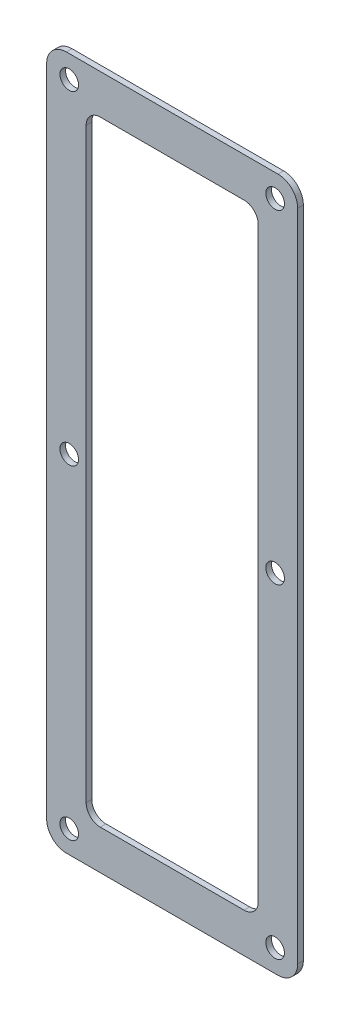
ISO-10303-21;
HEADER;
FILE_DESCRIPTION(('STEP AP214'),'2;1');
FILE_NAME('part.step','',(''),(''),'','','');
FILE_SCHEMA(('AUTOMOTIVE_DESIGN { 1 0 10303 214 1 1 1 1 }'));
ENDSEC;
DATA;
#1=APPLICATION_CONTEXT('core data for automotive mechanical design processes');
#2=APPLICATION_PROTOCOL_DEFINITION('international standard','automotive_design',2000,#1);
#3=PRODUCT_CONTEXT('',#1,'mechanical');
#4=PRODUCT('Part','Part','',(#3));
#5=PRODUCT_RELATED_PRODUCT_CATEGORY('part','',(#4));
#6=PRODUCT_DEFINITION_FORMATION('','',#4);
#7=PRODUCT_DEFINITION_CONTEXT('part definition',#1,'design');
#8=PRODUCT_DEFINITION('design','',#6,#7);
#9=PRODUCT_DEFINITION_SHAPE('','',#8);
#10=(LENGTH_UNIT() NAMED_UNIT(*) SI_UNIT(.MILLI.,.METRE.));
#11=(NAMED_UNIT(*) PLANE_ANGLE_UNIT() SI_UNIT($,.RADIAN.));
#12=(NAMED_UNIT(*) SI_UNIT($,.STERADIAN.) SOLID_ANGLE_UNIT());
#13=UNCERTAINTY_MEASURE_WITH_UNIT(LENGTH_MEASURE(1.E-05),#10,'distance_accuracy_value','');
#14=(GEOMETRIC_REPRESENTATION_CONTEXT(3) GLOBAL_UNCERTAINTY_ASSIGNED_CONTEXT((#13)) GLOBAL_UNIT_ASSIGNED_CONTEXT((#10,
#11,#12)) REPRESENTATION_CONTEXT('',''));
#15=CARTESIAN_POINT('',(0.,0.,0.));
#16=DIRECTION('',(0.,0.,1.));
#17=DIRECTION('',(1.,0.,0.));
#18=AXIS2_PLACEMENT_3D('',#15,#16,#17);
#19=CARTESIAN_POINT('',(0.,0.,0.));
#20=DIRECTION('',(0.,0.,-1.));
#21=DIRECTION('',(-1.,0.,0.));
#22=AXIS2_PLACEMENT_3D('',#19,#20,#21);
#23=PLANE('',#22);
#24=CARTESIAN_POINT('',(36.5,115.,0.));
#25=DIRECTION('',(0.,0.,1.));
#26=DIRECTION('',(1.,0.,0.));
#27=AXIS2_PLACEMENT_3D('',#24,#25,#26);
#28=CIRCLE('',#27,3.30000000000001);
#29=CARTESIAN_POINT('',(39.8,115.,0.));
#30=VERTEX_POINT('',#29);
#31=EDGE_CURVE('E315',#30,#30,#28,.T.);
#32=ORIENTED_EDGE('',*,*,#31,.T.);
#33=EDGE_LOOP('',(#32));
#34=FACE_BOUND('',#33,.T.);
#35=CARTESIAN_POINT('',(-36.5,-115.,0.));
#36=DIRECTION('',(0.,0.,1.));
#37=DIRECTION('',(1.,0.,0.));
#38=AXIS2_PLACEMENT_3D('',#35,#36,#37);
#39=CIRCLE('',#38,3.30000000000001);
#40=CARTESIAN_POINT('',(-33.2,-115.,0.));
#41=VERTEX_POINT('',#40);
#42=EDGE_CURVE('E309',#41,#41,#39,.T.);
#43=ORIENTED_EDGE('',*,*,#42,.T.);
#44=EDGE_LOOP('',(#43));
#45=FACE_BOUND('',#44,.T.);
#46=CARTESIAN_POINT('',(-36.5,115.,0.));
#47=DIRECTION('',(0.,0.,1.));
#48=DIRECTION('',(1.,0.,0.));
#49=AXIS2_PLACEMENT_3D('',#46,#47,#48);
#50=CIRCLE('',#49,3.30000000000001);
#51=CARTESIAN_POINT('',(-33.2,115.,0.));
#52=VERTEX_POINT('',#51);
#53=EDGE_CURVE('E303',#52,#52,#50,.T.);
#54=ORIENTED_EDGE('',*,*,#53,.T.);
#55=EDGE_LOOP('',(#54));
#56=FACE_BOUND('',#55,.T.);
#57=CARTESIAN_POINT('',(36.5,-115.,0.));
#58=DIRECTION('',(0.,0.,1.));
#59=DIRECTION('',(1.,0.,0.));
#60=AXIS2_PLACEMENT_3D('',#57,#58,#59);
#61=CIRCLE('',#60,3.30000000000001);
#62=CARTESIAN_POINT('',(39.8,-115.,0.));
#63=VERTEX_POINT('',#62);
#64=EDGE_CURVE('E297',#63,#63,#61,.T.);
#65=ORIENTED_EDGE('',*,*,#64,.T.);
#66=EDGE_LOOP('',(#65));
#67=FACE_BOUND('',#66,.T.);
#68=CARTESIAN_POINT('',(-36.5,0.,0.));
#69=DIRECTION('',(0.,0.,1.));
#70=DIRECTION('',(1.,0.,0.));
#71=AXIS2_PLACEMENT_3D('',#68,#69,#70);
#72=CIRCLE('',#71,3.30000000000001);
#73=CARTESIAN_POINT('',(-33.2,0.,0.));
#74=VERTEX_POINT('',#73);
#75=EDGE_CURVE('E291',#74,#74,#72,.T.);
#76=ORIENTED_EDGE('',*,*,#75,.T.);
#77=EDGE_LOOP('',(#76));
#78=FACE_BOUND('',#77,.T.);
#79=DIRECTION('',(0.,-1.,0.));
#80=VECTOR('',#79,1.);
#81=CARTESIAN_POINT('',(-30.5,-109.,0.));
#82=LINE('',#81,#80);
#83=CARTESIAN_POINT('',(-30.5,104.,0.));
#84=VERTEX_POINT('',#83);
#85=CARTESIAN_POINT('',(-30.5,-104.,0.));
#86=VERTEX_POINT('',#85);
#87=EDGE_CURVE('E273',#84,#86,#82,.T.);
#88=ORIENTED_EDGE('',*,*,#87,.T.);
#89=CARTESIAN_POINT('',(-25.5,-104.,0.));
#90=DIRECTION('',(0.,0.,-1.));
#91=DIRECTION('',(-1.,0.,0.));
#92=AXIS2_PLACEMENT_3D('',#89,#90,#91);
#93=CIRCLE('',#92,5.);
#94=CARTESIAN_POINT('',(-25.5,-109.,0.));
#95=VERTEX_POINT('',#94);
#96=EDGE_CURVE('E208',#86,#95,#93,.F.);
#97=ORIENTED_EDGE('',*,*,#96,.T.);
#98=DIRECTION('',(1.,0.,0.));
#99=VECTOR('',#98,1.);
#100=CARTESIAN_POINT('',(-30.5,-109.,0.));
#101=LINE('',#100,#99);
#102=CARTESIAN_POINT('',(25.5,-109.,0.));
#103=VERTEX_POINT('',#102);
#104=EDGE_CURVE('E159',#95,#103,#101,.T.);
#105=ORIENTED_EDGE('',*,*,#104,.T.);
#106=CARTESIAN_POINT('',(25.5,-104.,0.));
#107=DIRECTION('',(0.,0.,-1.));
#108=DIRECTION('',(-1.,0.,0.));
#109=AXIS2_PLACEMENT_3D('',#106,#107,#108);
#110=CIRCLE('',#109,5.);
#111=CARTESIAN_POINT('',(30.5,-104.,0.));
#112=VERTEX_POINT('',#111);
#113=EDGE_CURVE('E153',#103,#112,#110,.F.);
#114=ORIENTED_EDGE('',*,*,#113,.T.);
#115=DIRECTION('',(0.,1.,0.));
#116=VECTOR('',#115,1.);
#117=CARTESIAN_POINT('',(30.5,-109.,0.));
#118=LINE('',#117,#116);
#119=CARTESIAN_POINT('',(30.5,104.,0.));
#120=VERTEX_POINT('',#119);
#121=EDGE_CURVE('E157',#112,#120,#118,.T.);
#122=ORIENTED_EDGE('',*,*,#121,.T.);
#123=CARTESIAN_POINT('',(25.5,104.,0.));
#124=DIRECTION('',(0.,0.,-1.));
#125=DIRECTION('',(-1.,0.,0.));
#126=AXIS2_PLACEMENT_3D('',#123,#124,#125);
#127=CIRCLE('',#126,5.);
#128=CARTESIAN_POINT('',(25.5,109.,0.));
#129=VERTEX_POINT('',#128);
#130=EDGE_CURVE('E204',#120,#129,#127,.F.);
#131=ORIENTED_EDGE('',*,*,#130,.T.);
#132=DIRECTION('',(-1.,0.,0.));
#133=VECTOR('',#132,1.);
#134=CARTESIAN_POINT('',(-30.5,109.,0.));
#135=LINE('',#134,#133);
#136=CARTESIAN_POINT('',(-25.5,109.,0.));
#137=VERTEX_POINT('',#136);
#138=EDGE_CURVE('E175',#129,#137,#135,.T.);
#139=ORIENTED_EDGE('',*,*,#138,.T.);
#140=CARTESIAN_POINT('',(-25.5,104.,0.));
#141=DIRECTION('',(0.,0.,-1.));
#142=DIRECTION('',(-1.,0.,0.));
#143=AXIS2_PLACEMENT_3D('',#140,#141,#142);
#144=CIRCLE('',#143,5.);
#145=EDGE_CURVE('E212',#137,#84,#144,.F.);
#146=ORIENTED_EDGE('',*,*,#145,.T.);
#147=EDGE_LOOP('',(#88,#97,#105,#114,#122,#131,#139,#146));
#148=FACE_BOUND('',#147,.T.);
#149=DIRECTION('',(0.,1.,0.));
#150=VECTOR('',#149,1.);
#151=CARTESIAN_POINT('',(44.5,-123.,0.));
#152=LINE('',#151,#150);
#153=CARTESIAN_POINT('',(44.5,-116.,0.));
#154=VERTEX_POINT('',#153);
#155=CARTESIAN_POINT('',(44.5,116.,0.));
#156=VERTEX_POINT('',#155);
#157=EDGE_CURVE('E261',#154,#156,#152,.T.);
#158=ORIENTED_EDGE('',*,*,#157,.F.);
#159=CARTESIAN_POINT('',(37.5,-116.,0.));
#160=DIRECTION('',(0.,0.,-1.));
#161=DIRECTION('',(-1.,0.,0.));
#162=AXIS2_PLACEMENT_3D('',#159,#160,#161);
#163=CIRCLE('',#162,7.);
#164=CARTESIAN_POINT('',(37.5,-123.,0.));
#165=VERTEX_POINT('',#164);
#166=EDGE_CURVE('E227',#154,#165,#163,.T.);
#167=ORIENTED_EDGE('',*,*,#166,.T.);
#168=DIRECTION('',(1.,0.,0.));
#169=VECTOR('',#168,1.);
#170=CARTESIAN_POINT('',(-44.5,-123.,0.));
#171=LINE('',#170,#169);
#172=CARTESIAN_POINT('',(-37.5,-123.,0.));
#173=VERTEX_POINT('',#172);
#174=EDGE_CURVE('E188',#173,#165,#171,.T.);
#175=ORIENTED_EDGE('',*,*,#174,.F.);
#176=CARTESIAN_POINT('',(-37.5,-116.,0.));
#177=DIRECTION('',(0.,0.,-1.));
#178=DIRECTION('',(-1.,0.,0.));
#179=AXIS2_PLACEMENT_3D('',#176,#177,#178);
#180=CIRCLE('',#179,7.);
#181=CARTESIAN_POINT('',(-44.5,-116.,0.));
#182=VERTEX_POINT('',#181);
#183=EDGE_CURVE('E225',#173,#182,#180,.T.);
#184=ORIENTED_EDGE('',*,*,#183,.T.);
#185=DIRECTION('',(0.,-1.,0.));
#186=VECTOR('',#185,1.);
#187=CARTESIAN_POINT('',(-44.5,-123.,0.));
#188=LINE('',#187,#186);
#189=CARTESIAN_POINT('',(-44.5,116.,0.));
#190=VERTEX_POINT('',#189);
#191=EDGE_CURVE('E260',#190,#182,#188,.T.);
#192=ORIENTED_EDGE('',*,*,#191,.F.);
#193=CARTESIAN_POINT('',(-37.5,116.,0.));
#194=DIRECTION('',(0.,0.,-1.));
#195=DIRECTION('',(-1.,0.,0.));
#196=AXIS2_PLACEMENT_3D('',#193,#194,#195);
#197=CIRCLE('',#196,7.);
#198=CARTESIAN_POINT('',(-37.5,123.,0.));
#199=VERTEX_POINT('',#198);
#200=EDGE_CURVE('E223',#190,#199,#197,.T.);
#201=ORIENTED_EDGE('',*,*,#200,.T.);
#202=DIRECTION('',(-1.,0.,0.));
#203=VECTOR('',#202,1.);
#204=CARTESIAN_POINT('',(-44.5,123.,0.));
#205=LINE('',#204,#203);
#206=CARTESIAN_POINT('',(37.5,123.,0.));
#207=VERTEX_POINT('',#206);
#208=EDGE_CURVE('E251',#207,#199,#205,.T.);
#209=ORIENTED_EDGE('',*,*,#208,.F.);
#210=CARTESIAN_POINT('',(37.5,116.,0.));
#211=DIRECTION('',(0.,0.,-1.));
#212=DIRECTION('',(-1.,0.,0.));
#213=AXIS2_PLACEMENT_3D('',#210,#211,#212);
#214=CIRCLE('',#213,7.);
#215=EDGE_CURVE('E221',#207,#156,#214,.T.);
#216=ORIENTED_EDGE('',*,*,#215,.T.);
#217=EDGE_LOOP('',(#158,#167,#175,#184,#192,#201,#209,#216));
#218=FACE_BOUND('',#217,.T.);
#219=CARTESIAN_POINT('',(36.5,0.,0.));
#220=DIRECTION('',(0.,0.,1.));
#221=DIRECTION('',(1.,0.,0.));
#222=AXIS2_PLACEMENT_3D('',#219,#220,#221);
#223=CIRCLE('',#222,3.30000000000001);
#224=CARTESIAN_POINT('',(39.8,0.,0.));
#225=VERTEX_POINT('',#224);
#226=EDGE_CURVE('E176',#225,#225,#223,.T.);
#227=ORIENTED_EDGE('',*,*,#226,.T.);
#228=EDGE_LOOP('',(#227));
#229=FACE_BOUND('',#228,.T.);
#230=ADVANCED_FACE('F39',(#34,#45,#56,#67,#78,#148,#218,#229),#23,.T.);
#231=CARTESIAN_POINT('',(0.,0.,2.));
#232=DIRECTION('',(0.,0.,-1.));
#233=DIRECTION('',(-1.,0.,0.));
#234=AXIS2_PLACEMENT_3D('',#231,#232,#233);
#235=PLANE('',#234);
#236=CARTESIAN_POINT('',(36.5,115.,2.));
#237=DIRECTION('',(0.,0.,1.));
#238=DIRECTION('',(1.,0.,0.));
#239=AXIS2_PLACEMENT_3D('',#236,#237,#238);
#240=CIRCLE('',#239,3.30000000000001);
#241=CARTESIAN_POINT('',(39.8,115.,2.));
#242=VERTEX_POINT('',#241);
#243=EDGE_CURVE('E318',#242,#242,#240,.T.);
#244=ORIENTED_EDGE('',*,*,#243,.F.);
#245=EDGE_LOOP('',(#244));
#246=FACE_BOUND('',#245,.T.);
#247=CARTESIAN_POINT('',(-36.5,-115.,2.));
#248=DIRECTION('',(0.,0.,1.));
#249=DIRECTION('',(1.,0.,0.));
#250=AXIS2_PLACEMENT_3D('',#247,#248,#249);
#251=CIRCLE('',#250,3.30000000000001);
#252=CARTESIAN_POINT('',(-33.2,-115.,2.));
#253=VERTEX_POINT('',#252);
#254=EDGE_CURVE('E312',#253,#253,#251,.T.);
#255=ORIENTED_EDGE('',*,*,#254,.F.);
#256=EDGE_LOOP('',(#255));
#257=FACE_BOUND('',#256,.T.);
#258=CARTESIAN_POINT('',(-36.5,115.,2.));
#259=DIRECTION('',(0.,0.,1.));
#260=DIRECTION('',(1.,0.,0.));
#261=AXIS2_PLACEMENT_3D('',#258,#259,#260);
#262=CIRCLE('',#261,3.30000000000001);
#263=CARTESIAN_POINT('',(-33.2,115.,2.));
#264=VERTEX_POINT('',#263);
#265=EDGE_CURVE('E306',#264,#264,#262,.T.);
#266=ORIENTED_EDGE('',*,*,#265,.F.);
#267=EDGE_LOOP('',(#266));
#268=FACE_BOUND('',#267,.T.);
#269=CARTESIAN_POINT('',(36.5,-115.,2.));
#270=DIRECTION('',(0.,0.,1.));
#271=DIRECTION('',(1.,0.,0.));
#272=AXIS2_PLACEMENT_3D('',#269,#270,#271);
#273=CIRCLE('',#272,3.30000000000001);
#274=CARTESIAN_POINT('',(39.8,-115.,2.));
#275=VERTEX_POINT('',#274);
#276=EDGE_CURVE('E300',#275,#275,#273,.T.);
#277=ORIENTED_EDGE('',*,*,#276,.F.);
#278=EDGE_LOOP('',(#277));
#279=FACE_BOUND('',#278,.T.);
#280=CARTESIAN_POINT('',(-36.5,0.,2.));
#281=DIRECTION('',(0.,0.,1.));
#282=DIRECTION('',(1.,0.,0.));
#283=AXIS2_PLACEMENT_3D('',#280,#281,#282);
#284=CIRCLE('',#283,3.30000000000001);
#285=CARTESIAN_POINT('',(-33.2,0.,2.));
#286=VERTEX_POINT('',#285);
#287=EDGE_CURVE('E294',#286,#286,#284,.T.);
#288=ORIENTED_EDGE('',*,*,#287,.F.);
#289=EDGE_LOOP('',(#288));
#290=FACE_BOUND('',#289,.T.);
#291=CARTESIAN_POINT('',(36.5,0.,2.));
#292=DIRECTION('',(0.,0.,1.));
#293=DIRECTION('',(1.,0.,0.));
#294=AXIS2_PLACEMENT_3D('',#291,#292,#293);
#295=CIRCLE('',#294,3.30000000000001);
#296=CARTESIAN_POINT('',(39.8,0.,2.));
#297=VERTEX_POINT('',#296);
#298=EDGE_CURVE('E288',#297,#297,#295,.T.);
#299=ORIENTED_EDGE('',*,*,#298,.F.);
#300=EDGE_LOOP('',(#299));
#301=FACE_BOUND('',#300,.T.);
#302=DIRECTION('',(1.,0.,0.));
#303=VECTOR('',#302,1.);
#304=CARTESIAN_POINT('',(-44.5,-123.,2.));
#305=LINE('',#304,#303);
#306=CARTESIAN_POINT('',(-37.5,-123.,2.));
#307=VERTEX_POINT('',#306);
#308=CARTESIAN_POINT('',(37.5,-123.,2.));
#309=VERTEX_POINT('',#308);
#310=EDGE_CURVE('E180',#307,#309,#305,.T.);
#311=ORIENTED_EDGE('',*,*,#310,.T.);
#312=CARTESIAN_POINT('',(37.5,-116.,2.));
#313=DIRECTION('',(0.,0.,-1.));
#314=DIRECTION('',(-1.,0.,0.));
#315=AXIS2_PLACEMENT_3D('',#312,#313,#314);
#316=CIRCLE('',#315,7.);
#317=CARTESIAN_POINT('',(44.5,-116.,2.));
#318=VERTEX_POINT('',#317);
#319=EDGE_CURVE('E239',#309,#318,#316,.F.);
#320=ORIENTED_EDGE('',*,*,#319,.T.);
#321=DIRECTION('',(0.,1.,0.));
#322=VECTOR('',#321,1.);
#323=CARTESIAN_POINT('',(44.5,-123.,2.));
#324=LINE('',#323,#322);
#325=CARTESIAN_POINT('',(44.5,116.,2.));
#326=VERTEX_POINT('',#325);
#327=EDGE_CURVE('E268',#318,#326,#324,.T.);
#328=ORIENTED_EDGE('',*,*,#327,.T.);
#329=CARTESIAN_POINT('',(37.5,116.,2.));
#330=DIRECTION('',(0.,0.,-1.));
#331=DIRECTION('',(-1.,0.,0.));
#332=AXIS2_PLACEMENT_3D('',#329,#330,#331);
#333=CIRCLE('',#332,7.);
#334=CARTESIAN_POINT('',(37.5,123.,2.));
#335=VERTEX_POINT('',#334);
#336=EDGE_CURVE('E234',#326,#335,#333,.F.);
#337=ORIENTED_EDGE('',*,*,#336,.T.);
#338=DIRECTION('',(-1.,0.,0.));
#339=VECTOR('',#338,1.);
#340=CARTESIAN_POINT('',(-44.5,123.,2.));
#341=LINE('',#340,#339);
#342=CARTESIAN_POINT('',(-37.5,123.,2.));
#343=VERTEX_POINT('',#342);
#344=EDGE_CURVE('E253',#335,#343,#341,.T.);
#345=ORIENTED_EDGE('',*,*,#344,.T.);
#346=CARTESIAN_POINT('',(-37.5,116.,2.));
#347=DIRECTION('',(0.,0.,-1.));
#348=DIRECTION('',(-1.,0.,0.));
#349=AXIS2_PLACEMENT_3D('',#346,#347,#348);
#350=CIRCLE('',#349,7.);
#351=CARTESIAN_POINT('',(-44.5,116.,2.));
#352=VERTEX_POINT('',#351);
#353=EDGE_CURVE('E61',#343,#352,#350,.F.);
#354=ORIENTED_EDGE('',*,*,#353,.T.);
#355=DIRECTION('',(0.,-1.,0.));
#356=VECTOR('',#355,1.);
#357=CARTESIAN_POINT('',(-44.5,-123.,2.));
#358=LINE('',#357,#356);
#359=CARTESIAN_POINT('',(-44.5,-116.,2.));
#360=VERTEX_POINT('',#359);
#361=EDGE_CURVE('E185',#352,#360,#358,.T.);
#362=ORIENTED_EDGE('',*,*,#361,.T.);
#363=CARTESIAN_POINT('',(-37.5,-116.,2.));
#364=DIRECTION('',(0.,0.,-1.));
#365=DIRECTION('',(-1.,0.,0.));
#366=AXIS2_PLACEMENT_3D('',#363,#364,#365);
#367=CIRCLE('',#366,7.);
#368=EDGE_CURVE('E237',#360,#307,#367,.F.);
#369=ORIENTED_EDGE('',*,*,#368,.T.);
#370=EDGE_LOOP('',(#311,#320,#328,#337,#345,#354,#362,#369));
#371=FACE_BOUND('',#370,.T.);
#372=DIRECTION('',(0.,1.,0.));
#373=VECTOR('',#372,1.);
#374=CARTESIAN_POINT('',(30.5,-109.,2.));
#375=LINE('',#374,#373);
#376=CARTESIAN_POINT('',(30.5,-104.,2.));
#377=VERTEX_POINT('',#376);
#378=CARTESIAN_POINT('',(30.5,104.,2.));
#379=VERTEX_POINT('',#378);
#380=EDGE_CURVE('E272',#377,#379,#375,.T.);
#381=ORIENTED_EDGE('',*,*,#380,.F.);
#382=CARTESIAN_POINT('',(25.5,-104.,2.));
#383=DIRECTION('',(0.,0.,-1.));
#384=DIRECTION('',(-1.,0.,0.));
#385=AXIS2_PLACEMENT_3D('',#382,#383,#384);
#386=CIRCLE('',#385,5.);
#387=CARTESIAN_POINT('',(25.5,-109.,2.));
#388=VERTEX_POINT('',#387);
#389=EDGE_CURVE('E164',#377,#388,#386,.T.);
#390=ORIENTED_EDGE('',*,*,#389,.T.);
#391=DIRECTION('',(1.,0.,0.));
#392=VECTOR('',#391,1.);
#393=CARTESIAN_POINT('',(-30.5,-109.,2.));
#394=LINE('',#393,#392);
#395=CARTESIAN_POINT('',(-25.5,-109.,2.));
#396=VERTEX_POINT('',#395);
#397=EDGE_CURVE('E263',#396,#388,#394,.T.);
#398=ORIENTED_EDGE('',*,*,#397,.F.);
#399=CARTESIAN_POINT('',(-25.5,-104.,2.));
#400=DIRECTION('',(0.,0.,-1.));
#401=DIRECTION('',(-1.,0.,0.));
#402=AXIS2_PLACEMENT_3D('',#399,#400,#401);
#403=CIRCLE('',#402,5.);
#404=CARTESIAN_POINT('',(-30.5,-104.,2.));
#405=VERTEX_POINT('',#404);
#406=EDGE_CURVE('E165',#396,#405,#403,.T.);
#407=ORIENTED_EDGE('',*,*,#406,.T.);
#408=DIRECTION('',(0.,-1.,0.));
#409=VECTOR('',#408,1.);
#410=CARTESIAN_POINT('',(-30.5,-109.,2.));
#411=LINE('',#410,#409);
#412=CARTESIAN_POINT('',(-30.5,104.,2.));
#413=VERTEX_POINT('',#412);
#414=EDGE_CURVE('E279',#413,#405,#411,.T.);
#415=ORIENTED_EDGE('',*,*,#414,.F.);
#416=CARTESIAN_POINT('',(-25.5,104.,2.));
#417=DIRECTION('',(0.,0.,-1.));
#418=DIRECTION('',(-1.,0.,0.));
#419=AXIS2_PLACEMENT_3D('',#416,#417,#418);
#420=CIRCLE('',#419,5.);
#421=CARTESIAN_POINT('',(-25.5,109.,2.));
#422=VERTEX_POINT('',#421);
#423=EDGE_CURVE('E214',#413,#422,#420,.T.);
#424=ORIENTED_EDGE('',*,*,#423,.T.);
#425=DIRECTION('',(-1.,0.,0.));
#426=VECTOR('',#425,1.);
#427=CARTESIAN_POINT('',(-30.5,109.,2.));
#428=LINE('',#427,#426);
#429=CARTESIAN_POINT('',(25.5,109.,2.));
#430=VERTEX_POINT('',#429);
#431=EDGE_CURVE('E282',#430,#422,#428,.T.);
#432=ORIENTED_EDGE('',*,*,#431,.F.);
#433=CARTESIAN_POINT('',(25.5,104.,2.));
#434=DIRECTION('',(0.,0.,-1.));
#435=DIRECTION('',(-1.,0.,0.));
#436=AXIS2_PLACEMENT_3D('',#433,#434,#435);
#437=CIRCLE('',#436,5.);
#438=EDGE_CURVE('E206',#430,#379,#437,.T.);
#439=ORIENTED_EDGE('',*,*,#438,.T.);
#440=EDGE_LOOP('',(#381,#390,#398,#407,#415,#424,#432,#439));
#441=FACE_BOUND('',#440,.T.);
#442=ADVANCED_FACE('F324',(#246,#257,#268,#279,#290,#301,#371,#441),#235,.F.);
#443=CARTESIAN_POINT('',(44.5,-123.,2.));
#444=DIRECTION('',(-1.,0.,0.));
#445=DIRECTION('',(0.,-1.,0.));
#446=AXIS2_PLACEMENT_3D('',#443,#444,#445);
#447=PLANE('',#446);
#448=ORIENTED_EDGE('',*,*,#327,.F.);
#449=DIRECTION('',(0.,0.,-1.));
#450=VECTOR('',#449,1.);
#451=CARTESIAN_POINT('',(44.5,-116.,2.));
#452=LINE('',#451,#450);
#453=EDGE_CURVE('E218',#318,#154,#452,.T.);
#454=ORIENTED_EDGE('',*,*,#453,.T.);
#455=ORIENTED_EDGE('',*,*,#157,.T.);
#456=DIRECTION('',(0.,0.,-1.));
#457=VECTOR('',#456,1.);
#458=CARTESIAN_POINT('',(44.5,116.,2.));
#459=LINE('',#458,#457);
#460=EDGE_CURVE('E216',#156,#326,#459,.F.);
#461=ORIENTED_EDGE('',*,*,#460,.T.);
#462=EDGE_LOOP('',(#448,#454,#455,#461));
#463=FACE_BOUND('',#462,.T.);
#464=ADVANCED_FACE('F327',(#463),#447,.F.);
#465=CARTESIAN_POINT('',(-44.5,123.,2.));
#466=DIRECTION('',(0.,-1.,0.));
#467=DIRECTION('',(0.,0.,-1.));
#468=AXIS2_PLACEMENT_3D('',#465,#466,#467);
#469=PLANE('',#468);
#470=ORIENTED_EDGE('',*,*,#208,.T.);
#471=DIRECTION('',(0.,0.,-1.));
#472=VECTOR('',#471,1.);
#473=CARTESIAN_POINT('',(-37.5,123.,2.));
#474=LINE('',#473,#472);
#475=EDGE_CURVE('E11',#199,#343,#474,.F.);
#476=ORIENTED_EDGE('',*,*,#475,.T.);
#477=ORIENTED_EDGE('',*,*,#344,.F.);
#478=DIRECTION('',(0.,0.,-1.));
#479=VECTOR('',#478,1.);
#480=CARTESIAN_POINT('',(37.5,123.,2.));
#481=LINE('',#480,#479);
#482=EDGE_CURVE('E47',#335,#207,#481,.T.);
#483=ORIENTED_EDGE('',*,*,#482,.T.);
#484=EDGE_LOOP('',(#470,#476,#477,#483));
#485=FACE_BOUND('',#484,.T.);
#486=ADVANCED_FACE('F250',(#485),#469,.F.);
#487=CARTESIAN_POINT('',(-44.5,-123.,2.));
#488=DIRECTION('',(1.,0.,0.));
#489=DIRECTION('',(0.,0.,-1.));
#490=AXIS2_PLACEMENT_3D('',#487,#488,#489);
#491=PLANE('',#490);
#492=ORIENTED_EDGE('',*,*,#191,.T.);
#493=DIRECTION('',(0.,0.,-1.));
#494=VECTOR('',#493,1.);
#495=CARTESIAN_POINT('',(-44.5,-116.,2.));
#496=LINE('',#495,#494);
#497=EDGE_CURVE('E54',#182,#360,#496,.F.);
#498=ORIENTED_EDGE('',*,*,#497,.T.);
#499=ORIENTED_EDGE('',*,*,#361,.F.);
#500=DIRECTION('',(0.,0.,-1.));
#501=VECTOR('',#500,1.);
#502=CARTESIAN_POINT('',(-44.5,116.,2.));
#503=LINE('',#502,#501);
#504=EDGE_CURVE('E241',#352,#190,#503,.T.);
#505=ORIENTED_EDGE('',*,*,#504,.T.);
#506=EDGE_LOOP('',(#492,#498,#499,#505));
#507=FACE_BOUND('',#506,.T.);
#508=ADVANCED_FACE('F387',(#507),#491,.F.);
#509=CARTESIAN_POINT('',(-44.5,-123.,2.));
#510=DIRECTION('',(0.,1.,0.));
#511=DIRECTION('',(0.,0.,1.));
#512=AXIS2_PLACEMENT_3D('',#509,#510,#511);
#513=PLANE('',#512);
#514=ORIENTED_EDGE('',*,*,#174,.T.);
#515=DIRECTION('',(0.,0.,-1.));
#516=VECTOR('',#515,1.);
#517=CARTESIAN_POINT('',(37.5,-123.,2.));
#518=LINE('',#517,#516);
#519=EDGE_CURVE('E232',#165,#309,#518,.F.);
#520=ORIENTED_EDGE('',*,*,#519,.T.);
#521=ORIENTED_EDGE('',*,*,#310,.F.);
#522=DIRECTION('',(0.,0.,-1.));
#523=VECTOR('',#522,1.);
#524=CARTESIAN_POINT('',(-37.5,-123.,2.));
#525=LINE('',#524,#523);
#526=EDGE_CURVE('E229',#307,#173,#525,.T.);
#527=ORIENTED_EDGE('',*,*,#526,.T.);
#528=EDGE_LOOP('',(#514,#520,#521,#527));
#529=FACE_BOUND('',#528,.T.);
#530=ADVANCED_FACE('F384',(#529),#513,.F.);
#531=CARTESIAN_POINT('',(30.5,-109.,2.));
#532=DIRECTION('',(-1.,0.,0.));
#533=DIRECTION('',(0.,-1.,0.));
#534=AXIS2_PLACEMENT_3D('',#531,#532,#533);
#535=PLANE('',#534);
#536=ORIENTED_EDGE('',*,*,#380,.T.);
#537=DIRECTION('',(0.,0.,-1.));
#538=VECTOR('',#537,1.);
#539=CARTESIAN_POINT('',(30.5,104.,0.));
#540=LINE('',#539,#538);
#541=EDGE_CURVE('E174',#379,#120,#540,.T.);
#542=ORIENTED_EDGE('',*,*,#541,.T.);
#543=ORIENTED_EDGE('',*,*,#121,.F.);
#544=DIRECTION('',(0.,0.,-1.));
#545=VECTOR('',#544,1.);
#546=CARTESIAN_POINT('',(30.5,-104.,2.));
#547=LINE('',#546,#545);
#548=EDGE_CURVE('E171',#112,#377,#547,.F.);
#549=ORIENTED_EDGE('',*,*,#548,.T.);
#550=EDGE_LOOP('',(#536,#542,#543,#549));
#551=FACE_BOUND('',#550,.T.);
#552=ADVANCED_FACE('F170',(#551),#535,.T.);
#553=CARTESIAN_POINT('',(-30.5,109.,2.));
#554=DIRECTION('',(0.,-1.,0.));
#555=DIRECTION('',(0.,0.,-1.));
#556=AXIS2_PLACEMENT_3D('',#553,#554,#555);
#557=PLANE('',#556);
#558=ORIENTED_EDGE('',*,*,#138,.F.);
#559=DIRECTION('',(0.,0.,-1.));
#560=VECTOR('',#559,1.);
#561=CARTESIAN_POINT('',(25.5,109.,2.));
#562=LINE('',#561,#560);
#563=EDGE_CURVE('E193',#129,#430,#562,.F.);
#564=ORIENTED_EDGE('',*,*,#563,.T.);
#565=ORIENTED_EDGE('',*,*,#431,.T.);
#566=DIRECTION('',(0.,0.,-1.));
#567=VECTOR('',#566,1.);
#568=CARTESIAN_POINT('',(-25.5,109.,0.));
#569=LINE('',#568,#567);
#570=EDGE_CURVE('E182',#422,#137,#569,.T.);
#571=ORIENTED_EDGE('',*,*,#570,.T.);
#572=EDGE_LOOP('',(#558,#564,#565,#571));
#573=FACE_BOUND('',#572,.T.);
#574=ADVANCED_FACE('F349',(#573),#557,.T.);
#575=CARTESIAN_POINT('',(-30.5,-109.,2.));
#576=DIRECTION('',(1.,0.,0.));
#577=DIRECTION('',(0.,0.,-1.));
#578=AXIS2_PLACEMENT_3D('',#575,#576,#577);
#579=PLANE('',#578);
#580=ORIENTED_EDGE('',*,*,#414,.T.);
#581=DIRECTION('',(0.,0.,-1.));
#582=VECTOR('',#581,1.);
#583=CARTESIAN_POINT('',(-30.5,-104.,0.));
#584=LINE('',#583,#582);
#585=EDGE_CURVE('E197',#405,#86,#584,.T.);
#586=ORIENTED_EDGE('',*,*,#585,.T.);
#587=ORIENTED_EDGE('',*,*,#87,.F.);
#588=DIRECTION('',(0.,0.,-1.));
#589=VECTOR('',#588,1.);
#590=CARTESIAN_POINT('',(-30.5,104.,2.));
#591=LINE('',#590,#589);
#592=EDGE_CURVE('E195',#84,#413,#591,.F.);
#593=ORIENTED_EDGE('',*,*,#592,.T.);
#594=EDGE_LOOP('',(#580,#586,#587,#593));
#595=FACE_BOUND('',#594,.T.);
#596=ADVANCED_FACE('F357',(#595),#579,.T.);
#597=CARTESIAN_POINT('',(-30.5,-109.,2.));
#598=DIRECTION('',(0.,1.,0.));
#599=DIRECTION('',(-1.,0.,0.));
#600=AXIS2_PLACEMENT_3D('',#597,#598,#599);
#601=PLANE('',#600);
#602=ORIENTED_EDGE('',*,*,#104,.F.);
#603=DIRECTION('',(0.,0.,-1.));
#604=VECTOR('',#603,1.);
#605=CARTESIAN_POINT('',(-25.5,-109.,2.));
#606=LINE('',#605,#604);
#607=EDGE_CURVE('E202',#95,#396,#606,.F.);
#608=ORIENTED_EDGE('',*,*,#607,.T.);
#609=ORIENTED_EDGE('',*,*,#397,.T.);
#610=DIRECTION('',(0.,0.,-1.));
#611=VECTOR('',#610,1.);
#612=CARTESIAN_POINT('',(25.5,-109.,0.));
#613=LINE('',#612,#611);
#614=EDGE_CURVE('E200',#388,#103,#613,.T.);
#615=ORIENTED_EDGE('',*,*,#614,.T.);
#616=EDGE_LOOP('',(#602,#608,#609,#615));
#617=FACE_BOUND('',#616,.T.);
#618=ADVANCED_FACE('F365',(#617),#601,.T.);
#619=CARTESIAN_POINT('',(25.5,104.,2.));
#620=DIRECTION('',(0.,0.,1.));
#621=DIRECTION('',(1.,0.,0.));
#622=AXIS2_PLACEMENT_3D('',#619,#620,#621);
#623=CYLINDRICAL_SURFACE('',#622,5.);
#624=ORIENTED_EDGE('',*,*,#438,.F.);
#625=ORIENTED_EDGE('',*,*,#563,.F.);
#626=ORIENTED_EDGE('',*,*,#130,.F.);
#627=ORIENTED_EDGE('',*,*,#541,.F.);
#628=EDGE_LOOP('',(#624,#625,#626,#627));
#629=FACE_BOUND('',#628,.T.);
#630=ADVANCED_FACE('F345',(#629),#623,.F.);
#631=CARTESIAN_POINT('',(-25.5,-104.,2.));
#632=DIRECTION('',(0.,0.,1.));
#633=DIRECTION('',(1.,0.,0.));
#634=AXIS2_PLACEMENT_3D('',#631,#632,#633);
#635=CYLINDRICAL_SURFACE('',#634,5.);
#636=ORIENTED_EDGE('',*,*,#406,.F.);
#637=ORIENTED_EDGE('',*,*,#607,.F.);
#638=ORIENTED_EDGE('',*,*,#96,.F.);
#639=ORIENTED_EDGE('',*,*,#585,.F.);
#640=EDGE_LOOP('',(#636,#637,#638,#639));
#641=FACE_BOUND('',#640,.T.);
#642=ADVANCED_FACE('F362',(#641),#635,.F.);
#643=CARTESIAN_POINT('',(25.5,-104.,2.));
#644=DIRECTION('',(0.,0.,1.));
#645=DIRECTION('',(1.,0.,0.));
#646=AXIS2_PLACEMENT_3D('',#643,#644,#645);
#647=CYLINDRICAL_SURFACE('',#646,5.);
#648=ORIENTED_EDGE('',*,*,#389,.F.);
#649=ORIENTED_EDGE('',*,*,#548,.F.);
#650=ORIENTED_EDGE('',*,*,#113,.F.);
#651=ORIENTED_EDGE('',*,*,#614,.F.);
#652=EDGE_LOOP('',(#648,#649,#650,#651));
#653=FACE_BOUND('',#652,.T.);
#654=ADVANCED_FACE('F179',(#653),#647,.F.);
#655=CARTESIAN_POINT('',(-25.5,104.,2.));
#656=DIRECTION('',(0.,0.,1.));
#657=DIRECTION('',(1.,0.,0.));
#658=AXIS2_PLACEMENT_3D('',#655,#656,#657);
#659=CYLINDRICAL_SURFACE('',#658,5.);
#660=ORIENTED_EDGE('',*,*,#423,.F.);
#661=ORIENTED_EDGE('',*,*,#592,.F.);
#662=ORIENTED_EDGE('',*,*,#145,.F.);
#663=ORIENTED_EDGE('',*,*,#570,.F.);
#664=EDGE_LOOP('',(#660,#661,#662,#663));
#665=FACE_BOUND('',#664,.T.);
#666=ADVANCED_FACE('F353',(#665),#659,.F.);
#667=CARTESIAN_POINT('',(37.5,-116.,2.));
#668=DIRECTION('',(0.,0.,-1.));
#669=DIRECTION('',(-1.,0.,0.));
#670=AXIS2_PLACEMENT_3D('',#667,#668,#669);
#671=CYLINDRICAL_SURFACE('',#670,7.);
#672=ORIENTED_EDGE('',*,*,#319,.F.);
#673=ORIENTED_EDGE('',*,*,#519,.F.);
#674=ORIENTED_EDGE('',*,*,#166,.F.);
#675=ORIENTED_EDGE('',*,*,#453,.F.);
#676=EDGE_LOOP('',(#672,#673,#674,#675));
#677=FACE_BOUND('',#676,.T.);
#678=ADVANCED_FACE('F402',(#677),#671,.T.);
#679=CARTESIAN_POINT('',(-37.5,-116.,2.));
#680=DIRECTION('',(0.,0.,-1.));
#681=DIRECTION('',(-1.,0.,0.));
#682=AXIS2_PLACEMENT_3D('',#679,#680,#681);
#683=CYLINDRICAL_SURFACE('',#682,7.);
#684=ORIENTED_EDGE('',*,*,#368,.F.);
#685=ORIENTED_EDGE('',*,*,#497,.F.);
#686=ORIENTED_EDGE('',*,*,#183,.F.);
#687=ORIENTED_EDGE('',*,*,#526,.F.);
#688=EDGE_LOOP('',(#684,#685,#686,#687));
#689=FACE_BOUND('',#688,.T.);
#690=ADVANCED_FACE('F405',(#689),#683,.T.);
#691=CARTESIAN_POINT('',(-37.5,116.,2.));
#692=DIRECTION('',(0.,0.,-1.));
#693=DIRECTION('',(-1.,0.,0.));
#694=AXIS2_PLACEMENT_3D('',#691,#692,#693);
#695=CYLINDRICAL_SURFACE('',#694,7.);
#696=ORIENTED_EDGE('',*,*,#353,.F.);
#697=ORIENTED_EDGE('',*,*,#475,.F.);
#698=ORIENTED_EDGE('',*,*,#200,.F.);
#699=ORIENTED_EDGE('',*,*,#504,.F.);
#700=EDGE_LOOP('',(#696,#697,#698,#699));
#701=FACE_BOUND('',#700,.T.);
#702=ADVANCED_FACE('F408',(#701),#695,.T.);
#703=CARTESIAN_POINT('',(37.5,116.,2.));
#704=DIRECTION('',(0.,0.,-1.));
#705=DIRECTION('',(-1.,0.,0.));
#706=AXIS2_PLACEMENT_3D('',#703,#704,#705);
#707=CYLINDRICAL_SURFACE('',#706,7.);
#708=ORIENTED_EDGE('',*,*,#336,.F.);
#709=ORIENTED_EDGE('',*,*,#460,.F.);
#710=ORIENTED_EDGE('',*,*,#215,.F.);
#711=ORIENTED_EDGE('',*,*,#482,.F.);
#712=EDGE_LOOP('',(#708,#709,#710,#711));
#713=FACE_BOUND('',#712,.T.);
#714=ADVANCED_FACE('F41',(#713),#707,.T.);
#715=CARTESIAN_POINT('',(36.5,0.,2.));
#716=DIRECTION('',(0.,0.,1.));
#717=DIRECTION('',(1.,0.,0.));
#718=AXIS2_PLACEMENT_3D('',#715,#716,#717);
#719=CYLINDRICAL_SURFACE('',#718,3.30000000000001);
#720=ORIENTED_EDGE('',*,*,#226,.F.);
#721=EDGE_LOOP('',(#720));
#722=FACE_BOUND('',#721,.T.);
#723=ORIENTED_EDGE('',*,*,#298,.T.);
#724=EDGE_LOOP('',(#723));
#725=FACE_BOUND('',#724,.T.);
#726=ADVANCED_FACE('F414',(#722,#725),#719,.F.);
#727=CARTESIAN_POINT('',(-36.5,0.,2.));
#728=DIRECTION('',(0.,0.,1.));
#729=DIRECTION('',(1.,0.,0.));
#730=AXIS2_PLACEMENT_3D('',#727,#728,#729);
#731=CYLINDRICAL_SURFACE('',#730,3.30000000000001);
#732=ORIENTED_EDGE('',*,*,#75,.F.);
#733=EDGE_LOOP('',(#732));
#734=FACE_BOUND('',#733,.T.);
#735=ORIENTED_EDGE('',*,*,#287,.T.);
#736=EDGE_LOOP('',(#735));
#737=FACE_BOUND('',#736,.T.);
#738=ADVANCED_FACE('F427',(#734,#737),#731,.F.);
#739=CARTESIAN_POINT('',(36.5,-115.,2.));
#740=DIRECTION('',(0.,0.,1.));
#741=DIRECTION('',(1.,0.,0.));
#742=AXIS2_PLACEMENT_3D('',#739,#740,#741);
#743=CYLINDRICAL_SURFACE('',#742,3.30000000000001);
#744=ORIENTED_EDGE('',*,*,#64,.F.);
#745=EDGE_LOOP('',(#744));
#746=FACE_BOUND('',#745,.T.);
#747=ORIENTED_EDGE('',*,*,#276,.T.);
#748=EDGE_LOOP('',(#747));
#749=FACE_BOUND('',#748,.T.);
#750=ADVANCED_FACE('F432',(#746,#749),#743,.F.);
#751=CARTESIAN_POINT('',(-36.5,115.,2.));
#752=DIRECTION('',(0.,0.,1.));
#753=DIRECTION('',(1.,0.,0.));
#754=AXIS2_PLACEMENT_3D('',#751,#752,#753);
#755=CYLINDRICAL_SURFACE('',#754,3.30000000000001);
#756=ORIENTED_EDGE('',*,*,#53,.F.);
#757=EDGE_LOOP('',(#756));
#758=FACE_BOUND('',#757,.T.);
#759=ORIENTED_EDGE('',*,*,#265,.T.);
#760=EDGE_LOOP('',(#759));
#761=FACE_BOUND('',#760,.T.);
#762=ADVANCED_FACE('F440',(#758,#761),#755,.F.);
#763=CARTESIAN_POINT('',(-36.5,-115.,2.));
#764=DIRECTION('',(0.,0.,1.));
#765=DIRECTION('',(1.,0.,0.));
#766=AXIS2_PLACEMENT_3D('',#763,#764,#765);
#767=CYLINDRICAL_SURFACE('',#766,3.30000000000001);
#768=ORIENTED_EDGE('',*,*,#42,.F.);
#769=EDGE_LOOP('',(#768));
#770=FACE_BOUND('',#769,.T.);
#771=ORIENTED_EDGE('',*,*,#254,.T.);
#772=EDGE_LOOP('',(#771));
#773=FACE_BOUND('',#772,.T.);
#774=ADVANCED_FACE('F444',(#770,#773),#767,.F.);
#775=CARTESIAN_POINT('',(36.5,115.,2.));
#776=DIRECTION('',(0.,0.,1.));
#777=DIRECTION('',(1.,0.,0.));
#778=AXIS2_PLACEMENT_3D('',#775,#776,#777);
#779=CYLINDRICAL_SURFACE('',#778,3.30000000000001);
#780=ORIENTED_EDGE('',*,*,#31,.F.);
#781=EDGE_LOOP('',(#780));
#782=FACE_BOUND('',#781,.T.);
#783=ORIENTED_EDGE('',*,*,#243,.T.);
#784=EDGE_LOOP('',(#783));
#785=FACE_BOUND('',#784,.T.);
#786=ADVANCED_FACE('F322',(#782,#785),#779,.F.);
#787=CLOSED_SHELL('',(#230,#442,#464,#486,#508,#530,#552,#574,#596,#618,#630,#642,#654,#666,
#678,#690,#702,#714,#726,#738,#750,#762,#774,#786));
#788=MANIFOLD_SOLID_BREP('B2',#787);
#789=ADVANCED_BREP_SHAPE_REPRESENTATION('',(#18,#788),#14);
#790=SHAPE_DEFINITION_REPRESENTATION(#9,#789);
ENDSEC;
END-ISO-10303-21;
